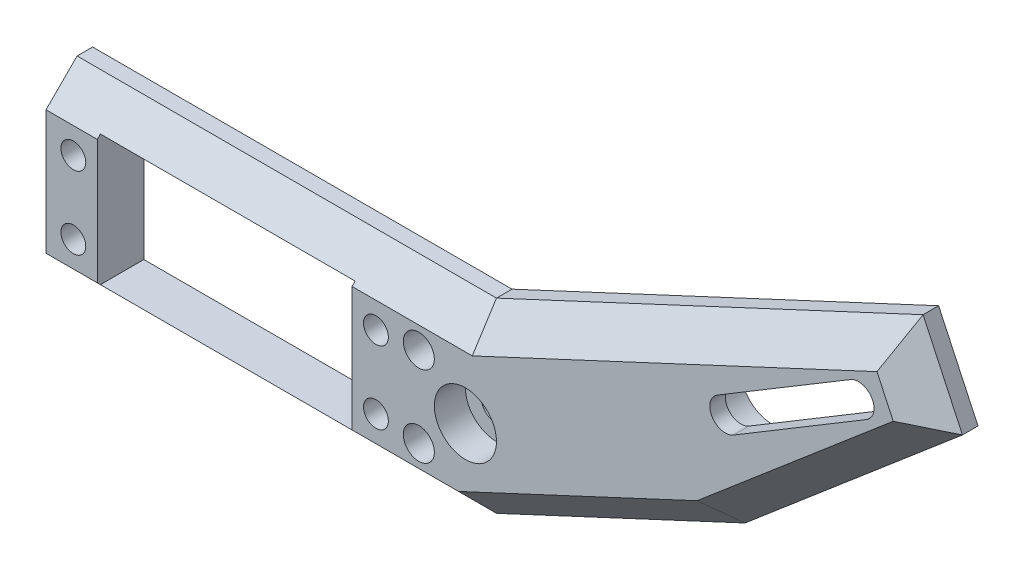
ISO-10303-21;
HEADER;
FILE_DESCRIPTION(('STEP AP214'),'2;1');
FILE_NAME('part.step','',(''),(''),'','','');
FILE_SCHEMA(('AUTOMOTIVE_DESIGN { 1 0 10303 214 1 1 1 1 }'));
ENDSEC;
DATA;
#1=APPLICATION_CONTEXT('core data for automotive mechanical design processes');
#2=APPLICATION_PROTOCOL_DEFINITION('international standard','automotive_design',2000,#1);
#3=PRODUCT_CONTEXT('',#1,'mechanical');
#4=PRODUCT('Part','Part','',(#3));
#5=PRODUCT_RELATED_PRODUCT_CATEGORY('part','',(#4));
#6=PRODUCT_DEFINITION_FORMATION('','',#4);
#7=PRODUCT_DEFINITION_CONTEXT('part definition',#1,'design');
#8=PRODUCT_DEFINITION('design','',#6,#7);
#9=PRODUCT_DEFINITION_SHAPE('','',#8);
#10=(LENGTH_UNIT() NAMED_UNIT(*) SI_UNIT(.MILLI.,.METRE.));
#11=(NAMED_UNIT(*) PLANE_ANGLE_UNIT() SI_UNIT($,.RADIAN.));
#12=(NAMED_UNIT(*) SI_UNIT($,.STERADIAN.) SOLID_ANGLE_UNIT());
#13=UNCERTAINTY_MEASURE_WITH_UNIT(LENGTH_MEASURE(1.E-05),#10,'distance_accuracy_value','');
#14=(GEOMETRIC_REPRESENTATION_CONTEXT(3) GLOBAL_UNCERTAINTY_ASSIGNED_CONTEXT((#13)) GLOBAL_UNIT_ASSIGNED_CONTEXT((#10,
#11,#12)) REPRESENTATION_CONTEXT('',''));
#15=CARTESIAN_POINT('',(0.,0.,0.));
#16=DIRECTION('',(0.,0.,1.));
#17=DIRECTION('',(1.,0.,0.));
#18=AXIS2_PLACEMENT_3D('',#15,#16,#17);
#19=CARTESIAN_POINT('',(80.5852401285649,22.1162762237483,22.5));
#20=DIRECTION('',(0.,0.,1.));
#21=DIRECTION('',(1.,0.,0.));
#22=AXIS2_PLACEMENT_3D('',#19,#20,#21);
#23=CYLINDRICAL_SURFACE('',#22,2.50000000000001);
#24=CARTESIAN_POINT('',(80.5852401285649,22.1162762237483,27.5));
#25=DIRECTION('',(0.,0.,-1.));
#26=DIRECTION('',(-1.,0.,0.));
#27=AXIS2_PLACEMENT_3D('',#24,#25,#26);
#28=CIRCLE('',#27,2.50000000000001);
#29=CARTESIAN_POINT('',(79.2976449412898,24.2591944755036,27.5));
#30=VERTEX_POINT('',#29);
#31=CARTESIAN_POINT('',(81.87283531584,19.973357971993,27.5));
#32=VERTEX_POINT('',#31);
#33=EDGE_CURVE('E62',#30,#32,#28,.F.);
#34=ORIENTED_EDGE('',*,*,#33,.F.);
#35=DIRECTION('',(0.,0.,1.));
#36=VECTOR('',#35,1.);
#37=CARTESIAN_POINT('',(79.2976449412898,24.2591944755036,22.5));
#38=LINE('',#37,#36);
#39=CARTESIAN_POINT('',(79.2976449412898,24.2591944755036,30.));
#40=VERTEX_POINT('',#39);
#41=EDGE_CURVE('E266',#30,#40,#38,.T.);
#42=ORIENTED_EDGE('',*,*,#41,.T.);
#43=CARTESIAN_POINT('',(80.5852401285649,22.1162762237483,30.));
#44=DIRECTION('',(0.,0.,1.));
#45=DIRECTION('',(1.,0.,0.));
#46=AXIS2_PLACEMENT_3D('',#43,#44,#45);
#47=CIRCLE('',#46,2.50000000000001);
#48=CARTESIAN_POINT('',(81.87283531584,19.973357971993,30.));
#49=VERTEX_POINT('',#48);
#50=EDGE_CURVE('E253',#40,#49,#47,.T.);
#51=ORIENTED_EDGE('',*,*,#50,.T.);
#52=DIRECTION('',(0.,0.,1.));
#53=VECTOR('',#52,1.);
#54=CARTESIAN_POINT('',(81.87283531584,19.973357971993,22.5));
#55=LINE('',#54,#53);
#56=EDGE_CURVE('E265',#32,#49,#55,.T.);
#57=ORIENTED_EDGE('',*,*,#56,.F.);
#58=EDGE_LOOP('',(#34,#42,#51,#57));
#59=FACE_BOUND('',#58,.T.);
#60=ADVANCED_FACE('F39',(#59),#23,.F.);
#61=CARTESIAN_POINT('',(79.2976449412898,24.2591944755036,22.5));
#62=DIRECTION('',(-0.515038074910049,0.857167300702115,0.));
#63=DIRECTION('',(-0.857167300702116,-0.515038074910049,0.));
#64=AXIS2_PLACEMENT_3D('',#61,#62,#63);
#65=PLANE('',#64);
#66=DIRECTION('',(-0.857167300702116,-0.515038074910049,0.));
#67=VECTOR('',#66,1.);
#68=CARTESIAN_POINT('',(79.2976449412898,24.2591944755036,27.5));
#69=LINE('',#68,#67);
#70=CARTESIAN_POINT('',(100.726827458843,37.1351463482548,27.5));
#71=VERTEX_POINT('',#70);
#72=EDGE_CURVE('E243',#71,#30,#69,.T.);
#73=ORIENTED_EDGE('',*,*,#72,.F.);
#74=DIRECTION('',(0.,0.,1.));
#75=VECTOR('',#74,1.);
#76=CARTESIAN_POINT('',(100.726827458843,37.1351463482548,22.5));
#77=LINE('',#76,#75);
#78=CARTESIAN_POINT('',(100.726827458843,37.1351463482548,30.));
#79=VERTEX_POINT('',#78);
#80=EDGE_CURVE('E269',#71,#79,#77,.T.);
#81=ORIENTED_EDGE('',*,*,#80,.T.);
#82=DIRECTION('',(-0.857167300702115,-0.515038074910049,0.));
#83=VECTOR('',#82,1.);
#84=CARTESIAN_POINT('',(79.2976449412898,24.2591944755036,30.));
#85=LINE('',#84,#83);
#86=EDGE_CURVE('E262',#79,#40,#85,.T.);
#87=ORIENTED_EDGE('',*,*,#86,.T.);
#88=ORIENTED_EDGE('',*,*,#41,.F.);
#89=EDGE_LOOP('',(#73,#81,#87,#88));
#90=FACE_BOUND('',#89,.T.);
#91=ADVANCED_FACE('F465',(#90),#65,.F.);
#92=CARTESIAN_POINT('',(102.014422646118,34.9922280964995,22.5));
#93=DIRECTION('',(0.,0.,1.));
#94=DIRECTION('',(1.,0.,0.));
#95=AXIS2_PLACEMENT_3D('',#92,#93,#94);
#96=CYLINDRICAL_SURFACE('',#95,2.5);
#97=CARTESIAN_POINT('',(102.014422646118,34.9922280964995,27.5));
#98=DIRECTION('',(0.,0.,-1.));
#99=DIRECTION('',(-1.,0.,0.));
#100=AXIS2_PLACEMENT_3D('',#97,#98,#99);
#101=CIRCLE('',#100,2.5);
#102=CARTESIAN_POINT('',(103.302017833393,32.8493098447442,27.5));
#103=VERTEX_POINT('',#102);
#104=EDGE_CURVE('E238',#103,#71,#101,.F.);
#105=ORIENTED_EDGE('',*,*,#104,.F.);
#106=DIRECTION('',(0.,0.,1.));
#107=VECTOR('',#106,1.);
#108=CARTESIAN_POINT('',(103.302017833393,32.8493098447442,22.5));
#109=LINE('',#108,#107);
#110=CARTESIAN_POINT('',(103.302017833393,32.8493098447442,30.));
#111=VERTEX_POINT('',#110);
#112=EDGE_CURVE('E271',#103,#111,#109,.T.);
#113=ORIENTED_EDGE('',*,*,#112,.T.);
#114=CARTESIAN_POINT('',(102.014422646118,34.9922280964995,30.));
#115=DIRECTION('',(0.,0.,1.));
#116=DIRECTION('',(1.,0.,0.));
#117=AXIS2_PLACEMENT_3D('',#114,#115,#116);
#118=CIRCLE('',#117,2.5);
#119=EDGE_CURVE('E259',#111,#79,#118,.T.);
#120=ORIENTED_EDGE('',*,*,#119,.T.);
#121=ORIENTED_EDGE('',*,*,#80,.F.);
#122=EDGE_LOOP('',(#105,#113,#120,#121));
#123=FACE_BOUND('',#122,.T.);
#124=ADVANCED_FACE('F459',(#123),#96,.F.);
#125=CARTESIAN_POINT('',(81.87283531584,19.973357971993,22.5));
#126=DIRECTION('',(0.515038074910049,-0.857167300702115,0.));
#127=DIRECTION('',(0.857167300702116,0.515038074910049,0.));
#128=AXIS2_PLACEMENT_3D('',#125,#126,#127);
#129=PLANE('',#128);
#130=DIRECTION('',(0.857167300702116,0.515038074910049,0.));
#131=VECTOR('',#130,1.);
#132=CARTESIAN_POINT('',(81.87283531584,19.973357971993,27.5));
#133=LINE('',#132,#131);
#134=EDGE_CURVE('E11',#32,#103,#133,.T.);
#135=ORIENTED_EDGE('',*,*,#134,.F.);
#136=ORIENTED_EDGE('',*,*,#56,.T.);
#137=DIRECTION('',(0.857167300702115,0.515038074910049,0.));
#138=VECTOR('',#137,1.);
#139=CARTESIAN_POINT('',(81.87283531584,19.973357971993,30.));
#140=LINE('',#139,#138);
#141=EDGE_CURVE('E256',#49,#111,#140,.T.);
#142=ORIENTED_EDGE('',*,*,#141,.T.);
#143=ORIENTED_EDGE('',*,*,#112,.F.);
#144=EDGE_LOOP('',(#135,#136,#142,#143));
#145=FACE_BOUND('',#144,.T.);
#146=ADVANCED_FACE('F448',(#145),#129,.F.);
#147=CARTESIAN_POINT('',(38.75,0.,0.));
#148=DIRECTION('',(0.,0.,1.));
#149=DIRECTION('',(1.,0.,0.));
#150=AXIS2_PLACEMENT_3D('',#147,#148,#149);
#151=CYLINDRICAL_SURFACE('',#150,2.5);
#152=CARTESIAN_POINT('',(38.75,0.,22.5));
#153=DIRECTION('',(0.,0.,1.));
#154=DIRECTION('',(1.,0.,0.));
#155=AXIS2_PLACEMENT_3D('',#152,#153,#154);
#156=CIRCLE('',#155,2.5);
#157=CARTESIAN_POINT('',(41.25,0.,22.5));
#158=VERTEX_POINT('',#157);
#159=EDGE_CURVE('E278',#158,#158,#156,.F.);
#160=ORIENTED_EDGE('',*,*,#159,.T.);
#161=EDGE_LOOP('',(#160));
#162=FACE_BOUND('',#161,.T.);
#163=CARTESIAN_POINT('',(38.75,0.,25.));
#164=DIRECTION('',(0.,0.,1.));
#165=DIRECTION('',(1.,0.,0.));
#166=AXIS2_PLACEMENT_3D('',#163,#164,#165);
#167=CIRCLE('',#166,2.5);
#168=CARTESIAN_POINT('',(41.25,0.,25.));
#169=VERTEX_POINT('',#168);
#170=EDGE_CURVE('E250',#169,#169,#167,.F.);
#171=ORIENTED_EDGE('',*,*,#170,.F.);
#172=EDGE_LOOP('',(#171));
#173=FACE_BOUND('',#172,.T.);
#174=ADVANCED_FACE('F445',(#162,#173),#151,.F.);
#175=CARTESIAN_POINT('',(0.,0.,30.));
#176=DIRECTION('',(0.,0.,-1.));
#177=DIRECTION('',(-1.,0.,0.));
#178=AXIS2_PLACEMENT_3D('',#175,#176,#177);
#179=PLANE('',#178);
#180=CARTESIAN_POINT('',(-24.35,-5.85,30.));
#181=DIRECTION('',(0.,0.,1.));
#182=DIRECTION('',(1.,0.,0.));
#183=AXIS2_PLACEMENT_3D('',#180,#181,#182);
#184=CIRCLE('',#183,2.);
#185=CARTESIAN_POINT('',(-22.35,-5.85,30.));
#186=VERTEX_POINT('',#185);
#187=EDGE_CURVE('E343',#186,#186,#184,.T.);
#188=ORIENTED_EDGE('',*,*,#187,.F.);
#189=EDGE_LOOP('',(#188));
#190=FACE_BOUND('',#189,.T.);
#191=CARTESIAN_POINT('',(-24.35,5.85,30.));
#192=DIRECTION('',(0.,0.,1.));
#193=DIRECTION('',(-1.,0.,0.));
#194=AXIS2_PLACEMENT_3D('',#191,#192,#193);
#195=CIRCLE('',#194,2.);
#196=CARTESIAN_POINT('',(-26.35,5.85,30.));
#197=VERTEX_POINT('',#196);
#198=EDGE_CURVE('E329',#197,#197,#195,.T.);
#199=ORIENTED_EDGE('',*,*,#198,.F.);
#200=EDGE_LOOP('',(#199));
#201=FACE_BOUND('',#200,.T.);
#202=DIRECTION('',(0.,-1.,0.));
#203=VECTOR('',#202,1.);
#204=CARTESIAN_POINT('',(-28.75,-15.,30.));
#205=LINE('',#204,#203);
#206=CARTESIAN_POINT('',(-28.75,9.99999999999991,30.));
#207=VERTEX_POINT('',#206);
#208=CARTESIAN_POINT('',(-28.75,-9.99999999999991,30.));
#209=VERTEX_POINT('',#208);
#210=EDGE_CURVE('E359',#207,#209,#205,.T.);
#211=ORIENTED_EDGE('',*,*,#210,.T.);
#212=DIRECTION('',(1.,0.,0.));
#213=VECTOR('',#212,1.);
#214=CARTESIAN_POINT('',(0.,-9.99999999999991,30.));
#215=LINE('',#214,#213);
#216=CARTESIAN_POINT('',(-20.5,-9.99999999999991,30.));
#217=VERTEX_POINT('',#216);
#218=EDGE_CURVE('E408',#209,#217,#215,.T.);
#219=ORIENTED_EDGE('',*,*,#218,.T.);
#220=DIRECTION('',(0.,-1.,0.));
#221=VECTOR('',#220,1.);
#222=CARTESIAN_POINT('',(-20.5,-10.5,30.));
#223=LINE('',#222,#221);
#224=CARTESIAN_POINT('',(-20.5,9.99999999999991,30.));
#225=VERTEX_POINT('',#224);
#226=EDGE_CURVE('E353',#225,#217,#223,.T.);
#227=ORIENTED_EDGE('',*,*,#226,.F.);
#228=DIRECTION('',(-1.,0.,0.));
#229=VECTOR('',#228,1.);
#230=CARTESIAN_POINT('',(0.,9.99999999999991,30.));
#231=LINE('',#230,#229);
#232=EDGE_CURVE('E394',#225,#207,#231,.T.);
#233=ORIENTED_EDGE('',*,*,#232,.T.);
#234=EDGE_LOOP('',(#211,#219,#227,#233));
#235=FACE_BOUND('',#234,.T.);
#236=ADVANCED_FACE('F447',(#190,#201,#235),#179,.F.);
#237=CARTESIAN_POINT('',(-28.75,15.,30.));
#238=DIRECTION('',(0.,-1.,0.));
#239=DIRECTION('',(0.,0.,-1.));
#240=AXIS2_PLACEMENT_3D('',#237,#238,#239);
#241=PLANE('',#240);
#242=DIRECTION('',(0.,0.,1.));
#243=VECTOR('',#242,1.);
#244=CARTESIAN_POINT('',(38.75,15.,0.));
#245=LINE('',#244,#243);
#246=CARTESIAN_POINT('',(38.75,15.,22.5));
#247=VERTEX_POINT('',#246);
#248=CARTESIAN_POINT('',(38.75,15.,25.));
#249=VERTEX_POINT('',#248);
#250=EDGE_CURVE('E327',#247,#249,#245,.T.);
#251=ORIENTED_EDGE('',*,*,#250,.F.);
#252=DIRECTION('',(-1.,0.,0.));
#253=VECTOR('',#252,1.);
#254=CARTESIAN_POINT('',(-28.75,15.,22.5));
#255=LINE('',#254,#253);
#256=CARTESIAN_POINT('',(-28.75,15.,22.5));
#257=VERTEX_POINT('',#256);
#258=EDGE_CURVE('E293',#247,#257,#255,.T.);
#259=ORIENTED_EDGE('',*,*,#258,.T.);
#260=DIRECTION('',(0.,0.,-1.));
#261=VECTOR('',#260,1.);
#262=CARTESIAN_POINT('',(-28.75,15.,30.));
#263=LINE('',#262,#261);
#264=CARTESIAN_POINT('',(-28.75,15.,25.));
#265=VERTEX_POINT('',#264);
#266=EDGE_CURVE('E370',#265,#257,#263,.T.);
#267=ORIENTED_EDGE('',*,*,#266,.F.);
#268=DIRECTION('',(1.,0.,0.));
#269=VECTOR('',#268,1.);
#270=CARTESIAN_POINT('',(-28.75,15.,25.));
#271=LINE('',#270,#269);
#272=EDGE_CURVE('E391',#265,#249,#271,.T.);
#273=ORIENTED_EDGE('',*,*,#272,.T.);
#274=EDGE_LOOP('',(#251,#259,#267,#273));
#275=FACE_BOUND('',#274,.T.);
#276=ADVANCED_FACE('F455',(#275),#241,.F.);
#277=CARTESIAN_POINT('',(-28.75,-15.,30.));
#278=DIRECTION('',(1.,0.,0.));
#279=DIRECTION('',(0.,0.,-1.));
#280=AXIS2_PLACEMENT_3D('',#277,#278,#279);
#281=PLANE('',#280);
#282=ORIENTED_EDGE('',*,*,#266,.T.);
#283=DIRECTION('',(0.,1.,0.));
#284=VECTOR('',#283,1.);
#285=CARTESIAN_POINT('',(-28.75,-15.,22.5));
#286=LINE('',#285,#284);
#287=CARTESIAN_POINT('',(-28.75,-15.,22.5));
#288=VERTEX_POINT('',#287);
#289=EDGE_CURVE('E276',#288,#257,#286,.T.);
#290=ORIENTED_EDGE('',*,*,#289,.F.);
#291=DIRECTION('',(0.,0.,-1.));
#292=VECTOR('',#291,1.);
#293=CARTESIAN_POINT('',(-28.75,-15.,30.));
#294=LINE('',#293,#292);
#295=CARTESIAN_POINT('',(-28.75,-15.,25.));
#296=VERTEX_POINT('',#295);
#297=EDGE_CURVE('E367',#296,#288,#294,.T.);
#298=ORIENTED_EDGE('',*,*,#297,.F.);
#299=DIRECTION('',(0.,-0.707106781186551,-0.707106781186544));
#300=VECTOR('',#299,1.);
#301=CARTESIAN_POINT('',(-28.75,-9.99999999999991,30.));
#302=LINE('',#301,#300);
#303=EDGE_CURVE('E375',#296,#209,#302,.F.);
#304=ORIENTED_EDGE('',*,*,#303,.T.);
#305=ORIENTED_EDGE('',*,*,#210,.F.);
#306=DIRECTION('',(0.,-0.707106781186551,0.707106781186544));
#307=VECTOR('',#306,1.);
#308=CARTESIAN_POINT('',(-28.75,9.99999999999991,30.));
#309=LINE('',#308,#307);
#310=EDGE_CURVE('E373',#207,#265,#309,.F.);
#311=ORIENTED_EDGE('',*,*,#310,.T.);
#312=EDGE_LOOP('',(#282,#290,#298,#304,#305,#311));
#313=FACE_BOUND('',#312,.T.);
#314=ADVANCED_FACE('F553',(#313),#281,.F.);
#315=CARTESIAN_POINT('',(-28.75,-15.,30.));
#316=DIRECTION('',(0.,1.,0.));
#317=DIRECTION('',(0.,0.,1.));
#318=AXIS2_PLACEMENT_3D('',#315,#316,#317);
#319=PLANE('',#318);
#320=ORIENTED_EDGE('',*,*,#297,.T.);
#321=DIRECTION('',(1.,0.,0.));
#322=VECTOR('',#321,1.);
#323=CARTESIAN_POINT('',(0.,-15.,22.5));
#324=LINE('',#323,#322);
#325=CARTESIAN_POINT('',(38.75,-15.,22.5));
#326=VERTEX_POINT('',#325);
#327=EDGE_CURVE('E268',#288,#326,#324,.T.);
#328=ORIENTED_EDGE('',*,*,#327,.T.);
#329=DIRECTION('',(0.,0.,1.));
#330=VECTOR('',#329,1.);
#331=CARTESIAN_POINT('',(38.75,-15.,0.));
#332=LINE('',#331,#330);
#333=CARTESIAN_POINT('',(38.75,-15.,25.));
#334=VERTEX_POINT('',#333);
#335=EDGE_CURVE('E336',#326,#334,#332,.T.);
#336=ORIENTED_EDGE('',*,*,#335,.T.);
#337=DIRECTION('',(-1.,0.,0.));
#338=VECTOR('',#337,1.);
#339=CARTESIAN_POINT('',(-28.75,-15.,25.));
#340=LINE('',#339,#338);
#341=EDGE_CURVE('E377',#334,#296,#340,.T.);
#342=ORIENTED_EDGE('',*,*,#341,.T.);
#343=EDGE_LOOP('',(#320,#328,#336,#342));
#344=FACE_BOUND('',#343,.T.);
#345=ADVANCED_FACE('F557',(#344),#319,.F.);
#346=CARTESIAN_POINT('',(38.75,0.,30.));
#347=DIRECTION('',(0.,0.,1.));
#348=DIRECTION('',(1.,0.,0.));
#349=AXIS2_PLACEMENT_3D('',#346,#347,#348);
#350=CIRCLE('',#349,5.);
#351=CARTESIAN_POINT('',(43.75,0.,30.));
#352=VERTEX_POINT('',#351);
#353=EDGE_CURVE('E246',#352,#352,#350,.T.);
#354=ORIENTED_EDGE('',*,*,#353,.F.);
#355=EDGE_LOOP('',(#354));
#356=FACE_BOUND('',#355,.T.);
#357=ORIENTED_EDGE('',*,*,#141,.F.);
#358=ORIENTED_EDGE('',*,*,#50,.F.);
#359=ORIENTED_EDGE('',*,*,#86,.F.);
#360=ORIENTED_EDGE('',*,*,#119,.F.);
#361=EDGE_LOOP('',(#357,#358,#359,#360));
#362=FACE_BOUND('',#361,.T.);
#363=CARTESIAN_POINT('',(31.25,6.5,30.));
#364=DIRECTION('',(0.,0.,1.));
#365=DIRECTION('',(1.,0.,0.));
#366=AXIS2_PLACEMENT_3D('',#363,#364,#365);
#367=CIRCLE('',#366,2.5);
#368=CARTESIAN_POINT('',(33.75,6.5,30.));
#369=VERTEX_POINT('',#368);
#370=EDGE_CURVE('E321',#369,#369,#367,.T.);
#371=ORIENTED_EDGE('',*,*,#370,.F.);
#372=EDGE_LOOP('',(#371));
#373=FACE_BOUND('',#372,.T.);
#374=CARTESIAN_POINT('',(31.25,-6.5,30.));
#375=DIRECTION('',(0.,0.,1.));
#376=DIRECTION('',(-1.,0.,0.));
#377=AXIS2_PLACEMENT_3D('',#374,#375,#376);
#378=CIRCLE('',#377,2.5);
#379=CARTESIAN_POINT('',(28.75,-6.5,30.));
#380=VERTEX_POINT('',#379);
#381=EDGE_CURVE('E320',#380,#380,#378,.T.);
#382=ORIENTED_EDGE('',*,*,#381,.F.);
#383=EDGE_LOOP('',(#382));
#384=FACE_BOUND('',#383,.T.);
#385=CARTESIAN_POINT('',(24.35,-5.85,30.));
#386=DIRECTION('',(0.,0.,1.));
#387=DIRECTION('',(-1.,0.,0.));
#388=AXIS2_PLACEMENT_3D('',#385,#386,#387);
#389=CIRCLE('',#388,2.);
#390=CARTESIAN_POINT('',(22.35,-5.85,30.));
#391=VERTEX_POINT('',#390);
#392=EDGE_CURVE('E339',#391,#391,#389,.T.);
#393=ORIENTED_EDGE('',*,*,#392,.F.);
#394=EDGE_LOOP('',(#393));
#395=FACE_BOUND('',#394,.T.);
#396=CARTESIAN_POINT('',(24.35,5.85,30.));
#397=DIRECTION('',(0.,0.,1.));
#398=DIRECTION('',(1.,0.,0.));
#399=AXIS2_PLACEMENT_3D('',#396,#397,#398);
#400=CIRCLE('',#399,2.);
#401=CARTESIAN_POINT('',(26.35,5.85,30.));
#402=VERTEX_POINT('',#401);
#403=EDGE_CURVE('E342',#402,#402,#400,.T.);
#404=ORIENTED_EDGE('',*,*,#403,.F.);
#405=EDGE_LOOP('',(#404));
#406=FACE_BOUND('',#405,.T.);
#407=DIRECTION('',(0.,1.,0.));
#408=VECTOR('',#407,1.);
#409=CARTESIAN_POINT('',(20.5,-10.5,30.));
#410=LINE('',#409,#408);
#411=CARTESIAN_POINT('',(20.5,-9.99999999999991,30.));
#412=VERTEX_POINT('',#411);
#413=CARTESIAN_POINT('',(20.5,9.99999999999991,30.));
#414=VERTEX_POINT('',#413);
#415=EDGE_CURVE('E350',#412,#414,#410,.T.);
#416=ORIENTED_EDGE('',*,*,#415,.F.);
#417=DIRECTION('',(1.,0.,0.));
#418=VECTOR('',#417,1.);
#419=CARTESIAN_POINT('',(0.,-9.99999999999991,30.));
#420=LINE('',#419,#418);
#421=CARTESIAN_POINT('',(37.6415266867853,-9.99999999999991,30.));
#422=VERTEX_POINT('',#421);
#423=EDGE_CURVE('E406',#412,#422,#420,.T.);
#424=ORIENTED_EDGE('',*,*,#423,.T.);
#425=DIRECTION('',(0.906307787036653,0.422618261740694,0.));
#426=VECTOR('',#425,1.);
#427=CARTESIAN_POINT('',(76.6369086912965,8.18384526138298,30.));
#428=LINE('',#427,#426);
#429=CARTESIAN_POINT('',(76.0248796432667,7.89845142927336,30.));
#430=VERTEX_POINT('',#429);
#431=EDGE_CURVE('E404',#422,#430,#428,.T.);
#432=ORIENTED_EDGE('',*,*,#431,.T.);
#433=DIRECTION('',(0.761723417099929,0.647902335110476,0.));
#434=VECTOR('',#433,1.);
#435=CARTESIAN_POINT('',(110.510488324448,37.2310226626874,30.));
#436=LINE('',#435,#434);
#437=CARTESIAN_POINT('',(107.608239851847,34.7624448032489,30.));
#438=VERTEX_POINT('',#437);
#439=EDGE_CURVE('E402',#430,#438,#436,.T.);
#440=ORIENTED_EDGE('',*,*,#439,.T.);
#441=DIRECTION('',(-0.422618261740701,0.906307787036649,0.));
#442=VECTOR('',#441,1.);
#443=CARTESIAN_POINT('',(102.879187138706,44.9039310740339,30.));
#444=LINE('',#443,#442);
#445=CARTESIAN_POINT('',(104.99227844741,40.3723921388506,30.));
#446=VERTEX_POINT('',#445);
#447=EDGE_CURVE('E400',#438,#446,#444,.T.);
#448=ORIENTED_EDGE('',*,*,#447,.T.);
#449=DIRECTION('',(-0.906307787036649,-0.422618261740702,0.));
#450=VECTOR('',#449,1.);
#451=CARTESIAN_POINT('',(40.8630913087035,10.4684610648167,30.));
#452=LINE('',#451,#450);
#453=CARTESIAN_POINT('',(39.8584733132147,9.99999999999991,30.));
#454=VERTEX_POINT('',#453);
#455=EDGE_CURVE('E398',#446,#454,#452,.T.);
#456=ORIENTED_EDGE('',*,*,#455,.T.);
#457=DIRECTION('',(-1.,0.,0.));
#458=VECTOR('',#457,1.);
#459=CARTESIAN_POINT('',(0.,9.99999999999991,30.));
#460=LINE('',#459,#458);
#461=EDGE_CURVE('E396',#454,#414,#460,.T.);
#462=ORIENTED_EDGE('',*,*,#461,.T.);
#463=EDGE_LOOP('',(#416,#424,#432,#440,#448,#456,#462));
#464=FACE_BOUND('',#463,.T.);
#465=ADVANCED_FACE('F458',(#356,#362,#373,#384,#395,#406,#464),#179,.F.);
#466=CARTESIAN_POINT('',(20.5,-10.5,5.));
#467=DIRECTION('',(1.,0.,0.));
#468=DIRECTION('',(0.,0.,-1.));
#469=AXIS2_PLACEMENT_3D('',#466,#467,#468);
#470=PLANE('',#469);
#471=DIRECTION('',(0.,0.,1.));
#472=VECTOR('',#471,1.);
#473=CARTESIAN_POINT('',(20.5,10.5,5.));
#474=LINE('',#473,#472);
#475=CARTESIAN_POINT('',(20.5,10.5,22.5));
#476=VERTEX_POINT('',#475);
#477=CARTESIAN_POINT('',(20.5,10.5,29.4999999999999));
#478=VERTEX_POINT('',#477);
#479=EDGE_CURVE('E356',#476,#478,#474,.T.);
#480=ORIENTED_EDGE('',*,*,#479,.F.);
#481=DIRECTION('',(0.,-1.,0.));
#482=VECTOR('',#481,1.);
#483=CARTESIAN_POINT('',(20.5,-10.5,22.5));
#484=LINE('',#483,#482);
#485=CARTESIAN_POINT('',(20.5,-10.5,22.5));
#486=VERTEX_POINT('',#485);
#487=EDGE_CURVE('E317',#476,#486,#484,.T.);
#488=ORIENTED_EDGE('',*,*,#487,.T.);
#489=DIRECTION('',(0.,0.,1.));
#490=VECTOR('',#489,1.);
#491=CARTESIAN_POINT('',(20.5,-10.5,5.));
#492=LINE('',#491,#490);
#493=CARTESIAN_POINT('',(20.5,-10.5,29.4999999999999));
#494=VERTEX_POINT('',#493);
#495=EDGE_CURVE('E357',#486,#494,#492,.T.);
#496=ORIENTED_EDGE('',*,*,#495,.T.);
#497=DIRECTION('',(0.,-0.707106781186551,-0.707106781186544));
#498=VECTOR('',#497,1.);
#499=CARTESIAN_POINT('',(20.5,-9.99999999999991,30.));
#500=LINE('',#499,#498);
#501=EDGE_CURVE('E422',#494,#412,#500,.F.);
#502=ORIENTED_EDGE('',*,*,#501,.T.);
#503=ORIENTED_EDGE('',*,*,#415,.T.);
#504=DIRECTION('',(0.,-0.707106781186551,0.707106781186544));
#505=VECTOR('',#504,1.);
#506=CARTESIAN_POINT('',(20.5,9.99999999999991,30.));
#507=LINE('',#506,#505);
#508=EDGE_CURVE('E419',#414,#478,#507,.F.);
#509=ORIENTED_EDGE('',*,*,#508,.T.);
#510=EDGE_LOOP('',(#480,#488,#496,#502,#503,#509));
#511=FACE_BOUND('',#510,.T.);
#512=ADVANCED_FACE('F534',(#511),#470,.F.);
#513=CARTESIAN_POINT('',(-20.5,-10.5,5.));
#514=DIRECTION('',(0.,-1.,0.));
#515=DIRECTION('',(0.,0.,-1.));
#516=AXIS2_PLACEMENT_3D('',#513,#514,#515);
#517=PLANE('',#516);
#518=ORIENTED_EDGE('',*,*,#495,.F.);
#519=DIRECTION('',(-1.,0.,0.));
#520=VECTOR('',#519,1.);
#521=CARTESIAN_POINT('',(-20.5,-10.5,22.5));
#522=LINE('',#521,#520);
#523=CARTESIAN_POINT('',(-20.5,-10.5,22.5));
#524=VERTEX_POINT('',#523);
#525=EDGE_CURVE('E314',#486,#524,#522,.T.);
#526=ORIENTED_EDGE('',*,*,#525,.T.);
#527=DIRECTION('',(0.,0.,1.));
#528=VECTOR('',#527,1.);
#529=CARTESIAN_POINT('',(-20.5,-10.5,5.));
#530=LINE('',#529,#528);
#531=CARTESIAN_POINT('',(-20.5,-10.5,29.4999999999999));
#532=VERTEX_POINT('',#531);
#533=EDGE_CURVE('E360',#524,#532,#530,.T.);
#534=ORIENTED_EDGE('',*,*,#533,.T.);
#535=DIRECTION('',(-1.,0.,0.));
#536=VECTOR('',#535,1.);
#537=CARTESIAN_POINT('',(0.,-10.5,29.4999999999999));
#538=LINE('',#537,#536);
#539=EDGE_CURVE('E416',#532,#494,#538,.F.);
#540=ORIENTED_EDGE('',*,*,#539,.T.);
#541=EDGE_LOOP('',(#518,#526,#534,#540));
#542=FACE_BOUND('',#541,.T.);
#543=ADVANCED_FACE('F532',(#542),#517,.F.);
#544=CARTESIAN_POINT('',(-20.5,-10.5,5.));
#545=DIRECTION('',(-1.,0.,0.));
#546=DIRECTION('',(0.,0.,1.));
#547=AXIS2_PLACEMENT_3D('',#544,#545,#546);
#548=PLANE('',#547);
#549=ORIENTED_EDGE('',*,*,#533,.F.);
#550=DIRECTION('',(0.,1.,0.));
#551=VECTOR('',#550,1.);
#552=CARTESIAN_POINT('',(-20.5,-10.5,22.5));
#553=LINE('',#552,#551);
#554=CARTESIAN_POINT('',(-20.5,10.5,22.5));
#555=VERTEX_POINT('',#554);
#556=EDGE_CURVE('E311',#524,#555,#553,.T.);
#557=ORIENTED_EDGE('',*,*,#556,.T.);
#558=DIRECTION('',(0.,0.,1.));
#559=VECTOR('',#558,1.);
#560=CARTESIAN_POINT('',(-20.5,10.5,5.));
#561=LINE('',#560,#559);
#562=CARTESIAN_POINT('',(-20.5,10.5,29.4999999999999));
#563=VERTEX_POINT('',#562);
#564=EDGE_CURVE('E362',#555,#563,#561,.T.);
#565=ORIENTED_EDGE('',*,*,#564,.T.);
#566=DIRECTION('',(0.,0.707106781186551,-0.707106781186544));
#567=VECTOR('',#566,1.);
#568=CARTESIAN_POINT('',(-20.5,9.99999999999991,30.));
#569=LINE('',#568,#567);
#570=EDGE_CURVE('E411',#563,#225,#569,.F.);
#571=ORIENTED_EDGE('',*,*,#570,.T.);
#572=ORIENTED_EDGE('',*,*,#226,.T.);
#573=DIRECTION('',(0.,0.707106781186551,0.707106781186544));
#574=VECTOR('',#573,1.);
#575=CARTESIAN_POINT('',(-20.5,-9.99999999999991,30.));
#576=LINE('',#575,#574);
#577=EDGE_CURVE('E413',#217,#532,#576,.F.);
#578=ORIENTED_EDGE('',*,*,#577,.T.);
#579=EDGE_LOOP('',(#549,#557,#565,#571,#572,#578));
#580=FACE_BOUND('',#579,.T.);
#581=ADVANCED_FACE('F511',(#580),#548,.F.);
#582=CARTESIAN_POINT('',(-20.5,10.5,5.));
#583=DIRECTION('',(0.,1.,0.));
#584=DIRECTION('',(0.,0.,1.));
#585=AXIS2_PLACEMENT_3D('',#582,#583,#584);
#586=PLANE('',#585);
#587=ORIENTED_EDGE('',*,*,#564,.F.);
#588=DIRECTION('',(1.,0.,0.));
#589=VECTOR('',#588,1.);
#590=CARTESIAN_POINT('',(-20.5,10.5,22.5));
#591=LINE('',#590,#589);
#592=EDGE_CURVE('E308',#555,#476,#591,.T.);
#593=ORIENTED_EDGE('',*,*,#592,.T.);
#594=ORIENTED_EDGE('',*,*,#479,.T.);
#595=DIRECTION('',(1.,0.,0.));
#596=VECTOR('',#595,1.);
#597=CARTESIAN_POINT('',(0.,10.5,29.4999999999999));
#598=LINE('',#597,#596);
#599=EDGE_CURVE('E48',#478,#563,#598,.F.);
#600=ORIENTED_EDGE('',*,*,#599,.T.);
#601=EDGE_LOOP('',(#587,#593,#594,#600));
#602=FACE_BOUND('',#601,.T.);
#603=ADVANCED_FACE('F512',(#602),#586,.F.);
#604=CARTESIAN_POINT('',(24.35,5.85,20.));
#605=DIRECTION('',(0.,0.,1.));
#606=DIRECTION('',(1.,0.,0.));
#607=AXIS2_PLACEMENT_3D('',#604,#605,#606);
#608=CYLINDRICAL_SURFACE('',#607,2.);
#609=CARTESIAN_POINT('',(24.35,5.85,22.5));
#610=DIRECTION('',(0.,0.,1.));
#611=DIRECTION('',(1.,0.,0.));
#612=AXIS2_PLACEMENT_3D('',#609,#610,#611);
#613=CIRCLE('',#612,2.);
#614=CARTESIAN_POINT('',(26.35,5.85,22.5));
#615=VERTEX_POINT('',#614);
#616=EDGE_CURVE('E305',#615,#615,#613,.F.);
#617=ORIENTED_EDGE('',*,*,#616,.T.);
#618=EDGE_LOOP('',(#617));
#619=FACE_BOUND('',#618,.T.);
#620=ORIENTED_EDGE('',*,*,#403,.T.);
#621=EDGE_LOOP('',(#620));
#622=FACE_BOUND('',#621,.T.);
#623=ADVANCED_FACE('F596',(#619,#622),#608,.F.);
#624=CARTESIAN_POINT('',(24.35,-5.85,20.));
#625=DIRECTION('',(0.,0.,1.));
#626=DIRECTION('',(1.,0.,0.));
#627=AXIS2_PLACEMENT_3D('',#624,#625,#626);
#628=CYLINDRICAL_SURFACE('',#627,2.);
#629=CARTESIAN_POINT('',(24.35,-5.85,22.5));
#630=DIRECTION('',(0.,0.,1.));
#631=DIRECTION('',(1.,0.,0.));
#632=AXIS2_PLACEMENT_3D('',#629,#630,#631);
#633=CIRCLE('',#632,2.);
#634=CARTESIAN_POINT('',(26.35,-5.85,22.5));
#635=VERTEX_POINT('',#634);
#636=EDGE_CURVE('E302',#635,#635,#633,.F.);
#637=ORIENTED_EDGE('',*,*,#636,.T.);
#638=EDGE_LOOP('',(#637));
#639=FACE_BOUND('',#638,.T.);
#640=ORIENTED_EDGE('',*,*,#392,.T.);
#641=EDGE_LOOP('',(#640));
#642=FACE_BOUND('',#641,.T.);
#643=ADVANCED_FACE('F592',(#639,#642),#628,.F.);
#644=CARTESIAN_POINT('',(-24.35,-5.85,20.));
#645=DIRECTION('',(0.,0.,1.));
#646=DIRECTION('',(1.,0.,0.));
#647=AXIS2_PLACEMENT_3D('',#644,#645,#646);
#648=CYLINDRICAL_SURFACE('',#647,2.);
#649=CARTESIAN_POINT('',(-24.35,-5.85,22.5));
#650=DIRECTION('',(0.,0.,1.));
#651=DIRECTION('',(1.,0.,0.));
#652=AXIS2_PLACEMENT_3D('',#649,#650,#651);
#653=CIRCLE('',#652,2.);
#654=CARTESIAN_POINT('',(-22.35,-5.85,22.5));
#655=VERTEX_POINT('',#654);
#656=EDGE_CURVE('E299',#655,#655,#653,.F.);
#657=ORIENTED_EDGE('',*,*,#656,.T.);
#658=EDGE_LOOP('',(#657));
#659=FACE_BOUND('',#658,.T.);
#660=ORIENTED_EDGE('',*,*,#187,.T.);
#661=EDGE_LOOP('',(#660));
#662=FACE_BOUND('',#661,.T.);
#663=ADVANCED_FACE('F595',(#659,#662),#648,.F.);
#664=CARTESIAN_POINT('',(-24.35,5.85,20.));
#665=DIRECTION('',(0.,0.,1.));
#666=DIRECTION('',(1.,0.,0.));
#667=AXIS2_PLACEMENT_3D('',#664,#665,#666);
#668=CYLINDRICAL_SURFACE('',#667,2.);
#669=CARTESIAN_POINT('',(-24.35,5.85,22.5));
#670=DIRECTION('',(0.,0.,1.));
#671=DIRECTION('',(1.,0.,0.));
#672=AXIS2_PLACEMENT_3D('',#669,#670,#671);
#673=CIRCLE('',#672,2.);
#674=CARTESIAN_POINT('',(-22.35,5.85,22.5));
#675=VERTEX_POINT('',#674);
#676=EDGE_CURVE('E296',#675,#675,#673,.F.);
#677=ORIENTED_EDGE('',*,*,#676,.T.);
#678=EDGE_LOOP('',(#677));
#679=FACE_BOUND('',#678,.T.);
#680=ORIENTED_EDGE('',*,*,#198,.T.);
#681=EDGE_LOOP('',(#680));
#682=FACE_BOUND('',#681,.T.);
#683=ADVANCED_FACE('F600',(#679,#682),#668,.F.);
#684=CARTESIAN_POINT('',(38.75,15.,0.));
#685=DIRECTION('',(-0.422618261740702,0.906307787036649,0.));
#686=DIRECTION('',(-0.906307787036649,-0.422618261740702,0.));
#687=AXIS2_PLACEMENT_3D('',#684,#685,#686);
#688=PLANE('',#687);
#689=DIRECTION('',(0.906307787036649,0.422618261740702,0.));
#690=VECTOR('',#689,1.);
#691=CARTESIAN_POINT('',(38.75,15.,22.5));
#692=LINE('',#691,#690);
#693=CARTESIAN_POINT('',(107.410726073889,47.0170223827375,22.5));
#694=VERTEX_POINT('',#693);
#695=EDGE_CURVE('E291',#247,#694,#692,.T.);
#696=ORIENTED_EDGE('',*,*,#695,.F.);
#697=ORIENTED_EDGE('',*,*,#250,.T.);
#698=DIRECTION('',(0.906307787036649,0.422618261740702,0.));
#699=VECTOR('',#698,1.);
#700=CARTESIAN_POINT('',(107.410726073889,47.0170223827375,25.));
#701=LINE('',#700,#699);
#702=CARTESIAN_POINT('',(107.410726073889,47.0170223827375,25.));
#703=VERTEX_POINT('',#702);
#704=EDGE_CURVE('E388',#249,#703,#701,.T.);
#705=ORIENTED_EDGE('',*,*,#704,.T.);
#706=DIRECTION('',(0.,0.,1.));
#707=VECTOR('',#706,1.);
#708=CARTESIAN_POINT('',(107.410726073889,47.0170223827375,0.));
#709=LINE('',#708,#707);
#710=EDGE_CURVE('E330',#694,#703,#709,.T.);
#711=ORIENTED_EDGE('',*,*,#710,.F.);
#712=EDGE_LOOP('',(#696,#697,#705,#711));
#713=FACE_BOUND('',#712,.T.);
#714=ADVANCED_FACE('F548',(#713),#688,.T.);
#715=CARTESIAN_POINT('',(107.410726073889,47.0170223827375,0.));
#716=DIRECTION('',(0.906307787036649,0.422618261740701,0.));
#717=DIRECTION('',(-0.422618261740701,0.906307787036649,0.));
#718=AXIS2_PLACEMENT_3D('',#715,#716,#717);
#719=PLANE('',#718);
#720=DIRECTION('',(0.422618261740701,-0.906307787036649,0.));
#721=VECTOR('',#720,1.);
#722=CARTESIAN_POINT('',(107.410726073889,47.0170223827375,22.5));
#723=LINE('',#722,#721);
#724=CARTESIAN_POINT('',(113.75,33.4224055771877,22.5));
#725=VERTEX_POINT('',#724);
#726=EDGE_CURVE('E289',#694,#725,#723,.T.);
#727=ORIENTED_EDGE('',*,*,#726,.F.);
#728=ORIENTED_EDGE('',*,*,#710,.T.);
#729=DIRECTION('',(0.422618261740701,-0.906307787036649,0.));
#730=VECTOR('',#729,1.);
#731=CARTESIAN_POINT('',(113.75,33.4224055771877,25.));
#732=LINE('',#731,#730);
#733=CARTESIAN_POINT('',(113.75,33.4224055771877,25.));
#734=VERTEX_POINT('',#733);
#735=EDGE_CURVE('E385',#703,#734,#732,.T.);
#736=ORIENTED_EDGE('',*,*,#735,.T.);
#737=DIRECTION('',(0.,0.,1.));
#738=VECTOR('',#737,1.);
#739=CARTESIAN_POINT('',(113.75,33.4224055771877,0.));
#740=LINE('',#739,#738);
#741=EDGE_CURVE('E332',#725,#734,#740,.T.);
#742=ORIENTED_EDGE('',*,*,#741,.F.);
#743=EDGE_LOOP('',(#727,#728,#736,#742));
#744=FACE_BOUND('',#743,.T.);
#745=ADVANCED_FACE('F575',(#744),#719,.T.);
#746=CARTESIAN_POINT('',(113.75,33.4224055771877,0.));
#747=DIRECTION('',(0.647902335110476,-0.761723417099929,0.));
#748=DIRECTION('',(0.761723417099929,0.647902335110476,0.));
#749=AXIS2_PLACEMENT_3D('',#746,#747,#748);
#750=PLANE('',#749);
#751=DIRECTION('',(-0.761723417099929,-0.647902335110476,0.));
#752=VECTOR('',#751,1.);
#753=CARTESIAN_POINT('',(113.75,33.4224055771877,22.5));
#754=LINE('',#753,#752);
#755=CARTESIAN_POINT('',(78.75,3.65230632619965,22.5));
#756=VERTEX_POINT('',#755);
#757=EDGE_CURVE('E287',#725,#756,#754,.T.);
#758=ORIENTED_EDGE('',*,*,#757,.F.);
#759=ORIENTED_EDGE('',*,*,#741,.T.);
#760=DIRECTION('',(-0.761723417099929,-0.647902335110476,0.));
#761=VECTOR('',#760,1.);
#762=CARTESIAN_POINT('',(78.75,3.65230632619965,25.));
#763=LINE('',#762,#761);
#764=CARTESIAN_POINT('',(78.75,3.65230632619965,25.));
#765=VERTEX_POINT('',#764);
#766=EDGE_CURVE('E382',#734,#765,#763,.T.);
#767=ORIENTED_EDGE('',*,*,#766,.T.);
#768=DIRECTION('',(0.,0.,1.));
#769=VECTOR('',#768,1.);
#770=CARTESIAN_POINT('',(78.75,3.65230632619965,0.));
#771=LINE('',#770,#769);
#772=EDGE_CURVE('E334',#756,#765,#771,.T.);
#773=ORIENTED_EDGE('',*,*,#772,.F.);
#774=EDGE_LOOP('',(#758,#759,#767,#773));
#775=FACE_BOUND('',#774,.T.);
#776=ADVANCED_FACE('F580',(#775),#750,.T.);
#777=CARTESIAN_POINT('',(78.75,3.65230632619965,0.));
#778=DIRECTION('',(0.422618261740694,-0.906307787036653,0.));
#779=DIRECTION('',(0.906307787036653,0.422618261740694,0.));
#780=AXIS2_PLACEMENT_3D('',#777,#778,#779);
#781=PLANE('',#780);
#782=DIRECTION('',(-0.906307787036653,-0.422618261740694,0.));
#783=VECTOR('',#782,1.);
#784=CARTESIAN_POINT('',(78.75,3.65230632619965,22.5));
#785=LINE('',#784,#783);
#786=EDGE_CURVE('E285',#756,#326,#785,.T.);
#787=ORIENTED_EDGE('',*,*,#786,.F.);
#788=ORIENTED_EDGE('',*,*,#772,.T.);
#789=DIRECTION('',(-0.906307787036653,-0.422618261740694,0.));
#790=VECTOR('',#789,1.);
#791=CARTESIAN_POINT('',(38.75,-15.,25.));
#792=LINE('',#791,#790);
#793=EDGE_CURVE('E379',#765,#334,#792,.T.);
#794=ORIENTED_EDGE('',*,*,#793,.T.);
#795=ORIENTED_EDGE('',*,*,#335,.F.);
#796=EDGE_LOOP('',(#787,#788,#794,#795));
#797=FACE_BOUND('',#796,.T.);
#798=ADVANCED_FACE('F582',(#797),#781,.T.);
#799=CARTESIAN_POINT('',(0.,9.99999999999991,30.));
#800=DIRECTION('',(0.,-0.707106781186544,-0.707106781186551));
#801=DIRECTION('',(-1.,0.,0.));
#802=AXIS2_PLACEMENT_3D('',#799,#800,#801);
#803=PLANE('',#802);
#804=ORIENTED_EDGE('',*,*,#508,.F.);
#805=ORIENTED_EDGE('',*,*,#461,.F.);
#806=DIRECTION('',(0.1548704352004,-0.69857538902428,0.698575389024273));
#807=VECTOR('',#806,1.);
#808=CARTESIAN_POINT('',(40.8262675324854,5.63456238534105,34.3654376146588));
#809=LINE('',#808,#807);
#810=EDGE_CURVE('E338',#249,#454,#809,.T.);
#811=ORIENTED_EDGE('',*,*,#810,.F.);
#812=ORIENTED_EDGE('',*,*,#272,.F.);
#813=ORIENTED_EDGE('',*,*,#310,.F.);
#814=ORIENTED_EDGE('',*,*,#232,.F.);
#815=ORIENTED_EDGE('',*,*,#570,.F.);
#816=ORIENTED_EDGE('',*,*,#599,.F.);
#817=EDGE_LOOP('',(#804,#805,#811,#812,#813,#814,#815,#816));
#818=FACE_BOUND('',#817,.T.);
#819=ADVANCED_FACE('F42',(#818),#803,.F.);
#820=CARTESIAN_POINT('',(3.28874804763456,-7.05274294796457,30.));
#821=DIRECTION('',(-0.29883623873012,0.640856382055784,0.707106781186551));
#822=DIRECTION('',(0.906307787036649,0.422618261740702,0.));
#823=AXIS2_PLACEMENT_3D('',#820,#821,#822);
#824=PLANE('',#823);
#825=ORIENTED_EDGE('',*,*,#810,.T.);
#826=ORIENTED_EDGE('',*,*,#455,.F.);
#827=DIRECTION('',(0.279258277633818,0.767255811994712,-0.577350269189622));
#828=VECTOR('',#827,1.);
#829=CARTESIAN_POINT('',(86.8994800097562,-9.33716302334652,67.4058099078807));
#830=LINE('',#829,#828);
#831=EDGE_CURVE('E434',#703,#446,#830,.F.);
#832=ORIENTED_EDGE('',*,*,#831,.F.);
#833=ORIENTED_EDGE('',*,*,#704,.F.);
#834=EDGE_LOOP('',(#825,#826,#832,#833));
#835=FACE_BOUND('',#834,.T.);
#836=ADVANCED_FACE('F543',(#835),#824,.T.);
#837=CARTESIAN_POINT('',(101.703530399775,47.4251350868151,30.));
#838=DIRECTION('',(0.640856382055785,0.298836238730119,0.707106781186551));
#839=DIRECTION('',(0.422618261740701,-0.906307787036649,0.));
#840=AXIS2_PLACEMENT_3D('',#837,#838,#839);
#841=PLANE('',#840);
#842=ORIENTED_EDGE('',*,*,#831,.T.);
#843=ORIENTED_EDGE('',*,*,#447,.F.);
#844=DIRECTION('',(0.764638267917948,-0.166832511859925,-0.62249115031617));
#845=VECTOR('',#844,1.);
#846=CARTESIAN_POINT('',(102.540588082031,35.8681298172776,34.1255695823124));
#847=LINE('',#846,#845);
#848=EDGE_CURVE('E431',#734,#438,#847,.F.);
#849=ORIENTED_EDGE('',*,*,#848,.F.);
#850=ORIENTED_EDGE('',*,*,#735,.F.);
#851=EDGE_LOOP('',(#842,#843,#849,#850));
#852=FACE_BOUND('',#851,.T.);
#853=ADVANCED_FACE('F572',(#852),#841,.T.);
#854=CARTESIAN_POINT('',(28.0154664840147,-32.9371198488016,30.));
#855=DIRECTION('',(0.458136134703215,-0.538619793619946,0.70710678118655));
#856=DIRECTION('',(-0.761723417099929,-0.647902335110476,0.));
#857=AXIS2_PLACEMENT_3D('',#854,#855,#856);
#858=PLANE('',#857);
#859=ORIENTED_EDGE('',*,*,#848,.T.);
#860=ORIENTED_EDGE('',*,*,#439,.F.);
#861=DIRECTION('',(0.383644656220263,-0.59777575485979,-0.703904059269048));
#862=VECTOR('',#861,1.);
#863=CARTESIAN_POINT('',(78.3236629390811,4.31660323294232,25.7822352870864));
#864=LINE('',#863,#862);
#865=EDGE_CURVE('E428',#765,#430,#864,.F.);
#866=ORIENTED_EDGE('',*,*,#865,.F.);
#867=ORIENTED_EDGE('',*,*,#766,.F.);
#868=EDGE_LOOP('',(#859,#860,#866,#867));
#869=FACE_BOUND('',#868,.T.);
#870=ADVANCED_FACE('F568',(#869),#858,.T.);
#871=CARTESIAN_POINT('',(10.5532320770119,-22.6314792228958,30.));
#872=DIRECTION('',(0.298836238730114,-0.640856382055787,0.707106781186551));
#873=DIRECTION('',(-0.906307787036653,-0.422618261740694,0.));
#874=AXIS2_PLACEMENT_3D('',#871,#872,#873);
#875=PLANE('',#874);
#876=ORIENTED_EDGE('',*,*,#865,.T.);
#877=ORIENTED_EDGE('',*,*,#431,.F.);
#878=DIRECTION('',(-0.154870435200395,0.698575389024281,0.698575389024273));
#879=VECTOR('',#878,1.);
#880=CARTESIAN_POINT('',(38.3584009521195,-13.2336108446995,26.7663891553005));
#881=LINE('',#880,#879);
#882=EDGE_CURVE('E324',#334,#422,#881,.T.);
#883=ORIENTED_EDGE('',*,*,#882,.F.);
#884=ORIENTED_EDGE('',*,*,#793,.F.);
#885=EDGE_LOOP('',(#876,#877,#883,#884));
#886=FACE_BOUND('',#885,.T.);
#887=ADVANCED_FACE('F563',(#886),#875,.T.);
#888=CARTESIAN_POINT('',(0.,-9.99999999999991,30.));
#889=DIRECTION('',(0.,0.707106781186544,-0.707106781186551));
#890=DIRECTION('',(1.,0.,0.));
#891=AXIS2_PLACEMENT_3D('',#888,#889,#890);
#892=PLANE('',#891);
#893=ORIENTED_EDGE('',*,*,#303,.F.);
#894=ORIENTED_EDGE('',*,*,#341,.F.);
#895=ORIENTED_EDGE('',*,*,#882,.T.);
#896=ORIENTED_EDGE('',*,*,#423,.F.);
#897=ORIENTED_EDGE('',*,*,#501,.F.);
#898=ORIENTED_EDGE('',*,*,#539,.F.);
#899=ORIENTED_EDGE('',*,*,#577,.F.);
#900=ORIENTED_EDGE('',*,*,#218,.F.);
#901=EDGE_LOOP('',(#893,#894,#895,#896,#897,#898,#899,#900));
#902=FACE_BOUND('',#901,.T.);
#903=ADVANCED_FACE('F525',(#902),#892,.F.);
#904=CARTESIAN_POINT('',(31.25,-6.5,0.));
#905=DIRECTION('',(0.,0.,1.));
#906=DIRECTION('',(1.,0.,0.));
#907=AXIS2_PLACEMENT_3D('',#904,#905,#906);
#908=CYLINDRICAL_SURFACE('',#907,2.5);
#909=CARTESIAN_POINT('',(31.25,-6.5,22.5));
#910=DIRECTION('',(0.,0.,1.));
#911=DIRECTION('',(1.,0.,0.));
#912=AXIS2_PLACEMENT_3D('',#909,#910,#911);
#913=CIRCLE('',#912,2.5);
#914=CARTESIAN_POINT('',(33.75,-6.5,22.5));
#915=VERTEX_POINT('',#914);
#916=EDGE_CURVE('E282',#915,#915,#913,.F.);
#917=ORIENTED_EDGE('',*,*,#916,.T.);
#918=EDGE_LOOP('',(#917));
#919=FACE_BOUND('',#918,.T.);
#920=ORIENTED_EDGE('',*,*,#381,.T.);
#921=EDGE_LOOP('',(#920));
#922=FACE_BOUND('',#921,.T.);
#923=ADVANCED_FACE('F485',(#919,#922),#908,.F.);
#924=CARTESIAN_POINT('',(31.25,6.5,0.));
#925=DIRECTION('',(0.,0.,1.));
#926=DIRECTION('',(1.,0.,0.));
#927=AXIS2_PLACEMENT_3D('',#924,#925,#926);
#928=CYLINDRICAL_SURFACE('',#927,2.5);
#929=CARTESIAN_POINT('',(31.25,6.5,22.5));
#930=DIRECTION('',(0.,0.,1.));
#931=DIRECTION('',(1.,0.,0.));
#932=AXIS2_PLACEMENT_3D('',#929,#930,#931);
#933=CIRCLE('',#932,2.5);
#934=CARTESIAN_POINT('',(33.75,6.5,22.5));
#935=VERTEX_POINT('',#934);
#936=EDGE_CURVE('E279',#935,#935,#933,.F.);
#937=ORIENTED_EDGE('',*,*,#936,.T.);
#938=EDGE_LOOP('',(#937));
#939=FACE_BOUND('',#938,.T.);
#940=ORIENTED_EDGE('',*,*,#370,.T.);
#941=EDGE_LOOP('',(#940));
#942=FACE_BOUND('',#941,.T.);
#943=ADVANCED_FACE('F476',(#939,#942),#928,.F.);
#944=CARTESIAN_POINT('',(0.,-15.,22.5));
#945=DIRECTION('',(0.,0.,1.));
#946=DIRECTION('',(1.,0.,0.));
#947=AXIS2_PLACEMENT_3D('',#944,#945,#946);
#948=PLANE('',#947);
#949=DIRECTION('',(-0.857167300702115,-0.515038074910049,0.));
#950=VECTOR('',#949,1.);
#951=CARTESIAN_POINT('',(104.589613020668,30.706391592989,22.5));
#952=LINE('',#951,#950);
#953=CARTESIAN_POINT('',(104.589613020668,30.706391592989,22.5));
#954=VERTEX_POINT('',#953);
#955=CARTESIAN_POINT('',(83.1604305031151,17.8304397202377,22.5));
#956=VERTEX_POINT('',#955);
#957=EDGE_CURVE('E232',#954,#956,#952,.T.);
#958=ORIENTED_EDGE('',*,*,#957,.F.);
#959=CARTESIAN_POINT('',(102.014422646118,34.9922280964995,22.5));
#960=DIRECTION('',(0.,0.,-1.));
#961=DIRECTION('',(-1.,0.,0.));
#962=AXIS2_PLACEMENT_3D('',#959,#960,#961);
#963=CIRCLE('',#962,4.99999999999998);
#964=CARTESIAN_POINT('',(99.4392322715675,39.2780646000101,22.5));
#965=VERTEX_POINT('',#964);
#966=EDGE_CURVE('E55',#965,#954,#963,.T.);
#967=ORIENTED_EDGE('',*,*,#966,.F.);
#968=DIRECTION('',(0.857167300702116,0.515038074910048,0.));
#969=VECTOR('',#968,1.);
#970=CARTESIAN_POINT('',(99.4392322715675,39.2780646000101,22.5));
#971=LINE('',#970,#969);
#972=CARTESIAN_POINT('',(78.0100497540146,26.4021127272589,22.5));
#973=VERTEX_POINT('',#972);
#974=EDGE_CURVE('E223',#973,#965,#971,.T.);
#975=ORIENTED_EDGE('',*,*,#974,.F.);
#976=CARTESIAN_POINT('',(80.5852401285649,22.1162762237483,22.5));
#977=DIRECTION('',(0.,0.,-1.));
#978=DIRECTION('',(-1.,0.,0.));
#979=AXIS2_PLACEMENT_3D('',#976,#977,#978);
#980=CIRCLE('',#979,4.99999999999999);
#981=EDGE_CURVE('E226',#956,#973,#980,.T.);
#982=ORIENTED_EDGE('',*,*,#981,.F.);
#983=EDGE_LOOP('',(#958,#967,#975,#982));
#984=FACE_BOUND('',#983,.T.);
#985=ORIENTED_EDGE('',*,*,#636,.F.);
#986=EDGE_LOOP('',(#985));
#987=FACE_BOUND('',#986,.T.);
#988=ORIENTED_EDGE('',*,*,#676,.F.);
#989=EDGE_LOOP('',(#988));
#990=FACE_BOUND('',#989,.T.);
#991=ORIENTED_EDGE('',*,*,#936,.F.);
#992=EDGE_LOOP('',(#991));
#993=FACE_BOUND('',#992,.T.);
#994=ORIENTED_EDGE('',*,*,#159,.F.);
#995=EDGE_LOOP('',(#994));
#996=FACE_BOUND('',#995,.T.);
#997=ORIENTED_EDGE('',*,*,#916,.F.);
#998=EDGE_LOOP('',(#997));
#999=FACE_BOUND('',#998,.T.);
#1000=ORIENTED_EDGE('',*,*,#695,.T.);
#1001=ORIENTED_EDGE('',*,*,#726,.T.);
#1002=ORIENTED_EDGE('',*,*,#757,.T.);
#1003=ORIENTED_EDGE('',*,*,#786,.T.);
#1004=ORIENTED_EDGE('',*,*,#327,.F.);
#1005=ORIENTED_EDGE('',*,*,#289,.T.);
#1006=ORIENTED_EDGE('',*,*,#258,.F.);
#1007=EDGE_LOOP('',(#1000,#1001,#1002,#1003,#1004,#1005,#1006));
#1008=FACE_BOUND('',#1007,.T.);
#1009=ORIENTED_EDGE('',*,*,#656,.F.);
#1010=EDGE_LOOP('',(#1009));
#1011=FACE_BOUND('',#1010,.T.);
#1012=ORIENTED_EDGE('',*,*,#616,.F.);
#1013=EDGE_LOOP('',(#1012));
#1014=FACE_BOUND('',#1013,.T.);
#1015=ORIENTED_EDGE('',*,*,#592,.F.);
#1016=ORIENTED_EDGE('',*,*,#556,.F.);
#1017=ORIENTED_EDGE('',*,*,#525,.F.);
#1018=ORIENTED_EDGE('',*,*,#487,.F.);
#1019=EDGE_LOOP('',(#1015,#1016,#1017,#1018));
#1020=FACE_BOUND('',#1019,.T.);
#1021=ADVANCED_FACE('F474',(#984,#987,#990,#993,#996,#999,#1008,#1011,#1014,#1020),#948,.F.);
#1022=CARTESIAN_POINT('',(38.75,0.,25.));
#1023=DIRECTION('',(0.,0.,1.));
#1024=DIRECTION('',(1.,0.,0.));
#1025=AXIS2_PLACEMENT_3D('',#1022,#1023,#1024);
#1026=PLANE('',#1025);
#1027=CARTESIAN_POINT('',(38.75,0.,25.));
#1028=DIRECTION('',(0.,0.,1.));
#1029=DIRECTION('',(1.,0.,0.));
#1030=AXIS2_PLACEMENT_3D('',#1027,#1028,#1029);
#1031=CIRCLE('',#1030,5.);
#1032=CARTESIAN_POINT('',(43.75,0.,25.));
#1033=VERTEX_POINT('',#1032);
#1034=EDGE_CURVE('E247',#1033,#1033,#1031,.T.);
#1035=ORIENTED_EDGE('',*,*,#1034,.T.);
#1036=EDGE_LOOP('',(#1035));
#1037=FACE_BOUND('',#1036,.T.);
#1038=ORIENTED_EDGE('',*,*,#170,.T.);
#1039=EDGE_LOOP('',(#1038));
#1040=FACE_BOUND('',#1039,.T.);
#1041=ADVANCED_FACE('F443',(#1037,#1040),#1026,.T.);
#1042=CARTESIAN_POINT('',(38.75,0.,25.));
#1043=DIRECTION('',(0.,0.,1.));
#1044=DIRECTION('',(1.,0.,0.));
#1045=AXIS2_PLACEMENT_3D('',#1042,#1043,#1044);
#1046=CYLINDRICAL_SURFACE('',#1045,5.);
#1047=ORIENTED_EDGE('',*,*,#1034,.F.);
#1048=EDGE_LOOP('',(#1047));
#1049=FACE_BOUND('',#1048,.T.);
#1050=ORIENTED_EDGE('',*,*,#353,.T.);
#1051=EDGE_LOOP('',(#1050));
#1052=FACE_BOUND('',#1051,.T.);
#1053=ADVANCED_FACE('F482',(#1049,#1052),#1046,.F.);
#1054=CARTESIAN_POINT('',(102.014422646118,34.9922280964995,27.5));
#1055=DIRECTION('',(0.,0.,-1.));
#1056=DIRECTION('',(-1.,0.,0.));
#1057=AXIS2_PLACEMENT_3D('',#1054,#1055,#1056);
#1058=PLANE('',#1057);
#1059=CARTESIAN_POINT('',(102.014422646118,34.9922280964995,27.5));
#1060=DIRECTION('',(0.,0.,-1.));
#1061=DIRECTION('',(-1.,0.,0.));
#1062=AXIS2_PLACEMENT_3D('',#1059,#1060,#1061);
#1063=CIRCLE('',#1062,4.99999999999998);
#1064=CARTESIAN_POINT('',(99.4392322715675,39.2780646000101,27.5));
#1065=VERTEX_POINT('',#1064);
#1066=CARTESIAN_POINT('',(104.589613020668,30.706391592989,27.5));
#1067=VERTEX_POINT('',#1066);
#1068=EDGE_CURVE('E205',#1065,#1067,#1063,.T.);
#1069=ORIENTED_EDGE('',*,*,#1068,.T.);
#1070=DIRECTION('',(-0.857167300702115,-0.515038074910049,0.));
#1071=VECTOR('',#1070,1.);
#1072=CARTESIAN_POINT('',(104.589613020668,30.706391592989,27.5));
#1073=LINE('',#1072,#1071);
#1074=CARTESIAN_POINT('',(83.1604305031151,17.8304397202377,27.5));
#1075=VERTEX_POINT('',#1074);
#1076=EDGE_CURVE('E214',#1067,#1075,#1073,.T.);
#1077=ORIENTED_EDGE('',*,*,#1076,.T.);
#1078=CARTESIAN_POINT('',(80.5852401285649,22.1162762237483,27.5));
#1079=DIRECTION('',(0.,0.,-1.));
#1080=DIRECTION('',(-1.,0.,0.));
#1081=AXIS2_PLACEMENT_3D('',#1078,#1079,#1080);
#1082=CIRCLE('',#1081,4.99999999999999);
#1083=CARTESIAN_POINT('',(78.0100497540146,26.4021127272589,27.5));
#1084=VERTEX_POINT('',#1083);
#1085=EDGE_CURVE('E219',#1075,#1084,#1082,.T.);
#1086=ORIENTED_EDGE('',*,*,#1085,.T.);
#1087=DIRECTION('',(0.857167300702116,0.515038074910048,0.));
#1088=VECTOR('',#1087,1.);
#1089=CARTESIAN_POINT('',(99.4392322715675,39.2780646000101,27.5));
#1090=LINE('',#1089,#1088);
#1091=EDGE_CURVE('E211',#1084,#1065,#1090,.T.);
#1092=ORIENTED_EDGE('',*,*,#1091,.T.);
#1093=EDGE_LOOP('',(#1069,#1077,#1086,#1092));
#1094=FACE_BOUND('',#1093,.T.);
#1095=ORIENTED_EDGE('',*,*,#33,.T.);
#1096=ORIENTED_EDGE('',*,*,#134,.T.);
#1097=ORIENTED_EDGE('',*,*,#104,.T.);
#1098=ORIENTED_EDGE('',*,*,#72,.T.);
#1099=EDGE_LOOP('',(#1095,#1096,#1097,#1098));
#1100=FACE_BOUND('',#1099,.T.);
#1101=ADVANCED_FACE('F221',(#1094,#1100),#1058,.T.);
#1102=CARTESIAN_POINT('',(102.014422646118,34.9922280964995,27.5));
#1103=DIRECTION('',(0.,0.,-1.));
#1104=DIRECTION('',(-1.,0.,0.));
#1105=AXIS2_PLACEMENT_3D('',#1102,#1103,#1104);
#1106=CYLINDRICAL_SURFACE('',#1105,4.99999999999998);
#1107=ORIENTED_EDGE('',*,*,#966,.T.);
#1108=DIRECTION('',(0.,0.,-1.));
#1109=VECTOR('',#1108,1.);
#1110=CARTESIAN_POINT('',(104.589613020668,30.706391592989,27.5));
#1111=LINE('',#1110,#1109);
#1112=EDGE_CURVE('E201',#1067,#954,#1111,.T.);
#1113=ORIENTED_EDGE('',*,*,#1112,.F.);
#1114=ORIENTED_EDGE('',*,*,#1068,.F.);
#1115=DIRECTION('',(0.,0.,-1.));
#1116=VECTOR('',#1115,1.);
#1117=CARTESIAN_POINT('',(99.4392322715675,39.2780646000101,27.5));
#1118=LINE('',#1117,#1116);
#1119=EDGE_CURVE('E236',#1065,#965,#1118,.T.);
#1120=ORIENTED_EDGE('',*,*,#1119,.T.);
#1121=EDGE_LOOP('',(#1107,#1113,#1114,#1120));
#1122=FACE_BOUND('',#1121,.T.);
#1123=ADVANCED_FACE('F203',(#1122),#1106,.F.);
#1124=CARTESIAN_POINT('',(99.4392322715675,39.2780646000101,27.5));
#1125=DIRECTION('',(-0.515038074910048,0.857167300702116,0.));
#1126=DIRECTION('',(-0.857167300702116,-0.515038074910048,0.));
#1127=AXIS2_PLACEMENT_3D('',#1124,#1125,#1126);
#1128=PLANE('',#1127);
#1129=ORIENTED_EDGE('',*,*,#974,.T.);
#1130=ORIENTED_EDGE('',*,*,#1119,.F.);
#1131=ORIENTED_EDGE('',*,*,#1091,.F.);
#1132=DIRECTION('',(0.,0.,-1.));
#1133=VECTOR('',#1132,1.);
#1134=CARTESIAN_POINT('',(78.0100497540146,26.4021127272589,27.5));
#1135=LINE('',#1134,#1133);
#1136=EDGE_CURVE('E239',#1084,#973,#1135,.T.);
#1137=ORIENTED_EDGE('',*,*,#1136,.T.);
#1138=EDGE_LOOP('',(#1129,#1130,#1131,#1137));
#1139=FACE_BOUND('',#1138,.T.);
#1140=ADVANCED_FACE('F752',(#1139),#1128,.F.);
#1141=CARTESIAN_POINT('',(80.5852401285649,22.1162762237483,27.5));
#1142=DIRECTION('',(0.,0.,-1.));
#1143=DIRECTION('',(-1.,0.,0.));
#1144=AXIS2_PLACEMENT_3D('',#1141,#1142,#1143);
#1145=CYLINDRICAL_SURFACE('',#1144,4.99999999999999);
#1146=ORIENTED_EDGE('',*,*,#981,.T.);
#1147=ORIENTED_EDGE('',*,*,#1136,.F.);
#1148=ORIENTED_EDGE('',*,*,#1085,.F.);
#1149=DIRECTION('',(0.,0.,-1.));
#1150=VECTOR('',#1149,1.);
#1151=CARTESIAN_POINT('',(83.1604305031151,17.8304397202377,27.5));
#1152=LINE('',#1151,#1150);
#1153=EDGE_CURVE('E210',#1075,#956,#1152,.T.);
#1154=ORIENTED_EDGE('',*,*,#1153,.T.);
#1155=EDGE_LOOP('',(#1146,#1147,#1148,#1154));
#1156=FACE_BOUND('',#1155,.T.);
#1157=ADVANCED_FACE('F761',(#1156),#1145,.F.);
#1158=CARTESIAN_POINT('',(104.589613020668,30.706391592989,27.5));
#1159=DIRECTION('',(0.515038074910049,-0.857167300702115,0.));
#1160=DIRECTION('',(0.857167300702115,0.515038074910049,0.));
#1161=AXIS2_PLACEMENT_3D('',#1158,#1159,#1160);
#1162=PLANE('',#1161);
#1163=ORIENTED_EDGE('',*,*,#957,.T.);
#1164=ORIENTED_EDGE('',*,*,#1153,.F.);
#1165=ORIENTED_EDGE('',*,*,#1076,.F.);
#1166=ORIENTED_EDGE('',*,*,#1112,.T.);
#1167=EDGE_LOOP('',(#1163,#1164,#1165,#1166));
#1168=FACE_BOUND('',#1167,.T.);
#1169=ADVANCED_FACE('F215',(#1168),#1162,.F.);
#1170=CLOSED_SHELL('',(#60,#91,#124,#146,#174,#236,#276,#314,#345,#465,#512,#543,#581,#603,#623,
#643,#663,#683,#714,#745,#776,#798,#819,#836,#853,#870,#887,#903,#923,#943,#1021,#1041,#1053,
#1101,#1123,#1140,#1157,#1169));
#1171=MANIFOLD_SOLID_BREP('B2',#1170);
#1172=ADVANCED_BREP_SHAPE_REPRESENTATION('',(#18,#1171),#14);
#1173=SHAPE_DEFINITION_REPRESENTATION(#9,#1172);
ENDSEC;
END-ISO-10303-21;
